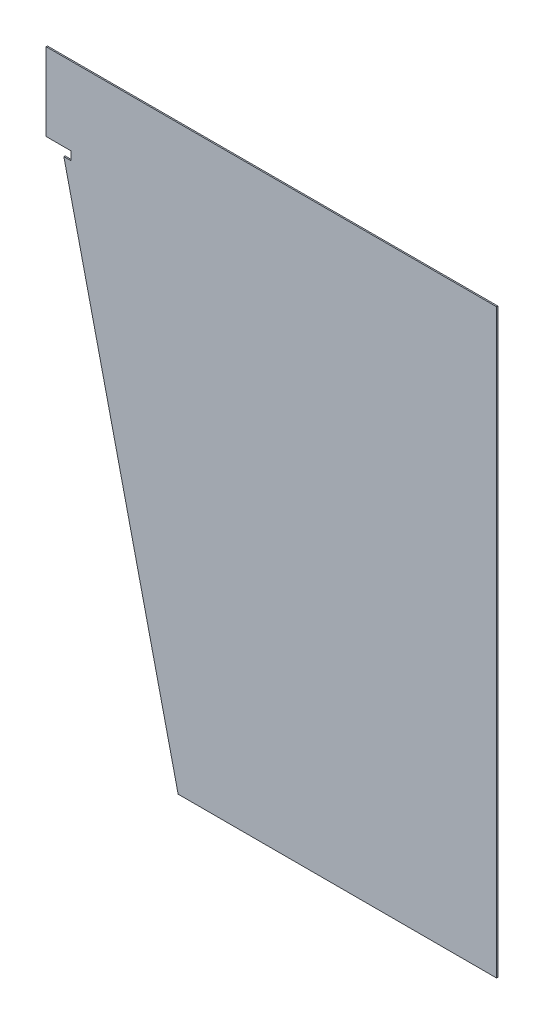
ISO-10303-21;
HEADER;
FILE_DESCRIPTION(('STEP AP214'),'2;1');
FILE_NAME('part.step','',(''),(''),'','','');
FILE_SCHEMA(('AUTOMOTIVE_DESIGN { 1 0 10303 214 1 1 1 1 }'));
ENDSEC;
DATA;
#1=APPLICATION_CONTEXT('core data for automotive mechanical design processes');
#2=APPLICATION_PROTOCOL_DEFINITION('international standard','automotive_design',2000,#1);
#3=PRODUCT_CONTEXT('',#1,'mechanical');
#4=PRODUCT('Part','Part','',(#3));
#5=PRODUCT_RELATED_PRODUCT_CATEGORY('part','',(#4));
#6=PRODUCT_DEFINITION_FORMATION('','',#4);
#7=PRODUCT_DEFINITION_CONTEXT('part definition',#1,'design');
#8=PRODUCT_DEFINITION('design','',#6,#7);
#9=PRODUCT_DEFINITION_SHAPE('','',#8);
#10=(LENGTH_UNIT() NAMED_UNIT(*) SI_UNIT(.MILLI.,.METRE.));
#11=(NAMED_UNIT(*) PLANE_ANGLE_UNIT() SI_UNIT($,.RADIAN.));
#12=(NAMED_UNIT(*) SI_UNIT($,.STERADIAN.) SOLID_ANGLE_UNIT());
#13=UNCERTAINTY_MEASURE_WITH_UNIT(LENGTH_MEASURE(1.E-05),#10,'distance_accuracy_value','');
#14=(GEOMETRIC_REPRESENTATION_CONTEXT(3) GLOBAL_UNCERTAINTY_ASSIGNED_CONTEXT((#13)) GLOBAL_UNIT_ASSIGNED_CONTEXT((#10,
#11,#12)) REPRESENTATION_CONTEXT('',''));
#15=CARTESIAN_POINT('',(0.,0.,0.));
#16=DIRECTION('',(0.,0.,1.));
#17=DIRECTION('',(1.,0.,0.));
#18=AXIS2_PLACEMENT_3D('',#15,#16,#17);
#19=CARTESIAN_POINT('',(670.,0.,1.9));
#20=DIRECTION('',(0.,-1.,0.));
#21=DIRECTION('',(1.,0.,0.));
#22=AXIS2_PLACEMENT_3D('',#19,#20,#21);
#23=PLANE('',#22);
#24=DIRECTION('',(-1.,0.,0.));
#25=VECTOR('',#24,1.);
#26=CARTESIAN_POINT('',(670.,0.,0.));
#27=LINE('',#26,#25);
#28=CARTESIAN_POINT('',(670.,0.,0.));
#29=VERTEX_POINT('',#28);
#30=CARTESIAN_POINT('',(0.,0.,0.));
#31=VERTEX_POINT('',#30);
#32=EDGE_CURVE('E132',#29,#31,#27,.T.);
#33=ORIENTED_EDGE('',*,*,#32,.T.);
#34=DIRECTION('',(0.,0.,-1.));
#35=VECTOR('',#34,1.);
#36=CARTESIAN_POINT('',(0.,0.,1.9));
#37=LINE('',#36,#35);
#38=CARTESIAN_POINT('',(0.,0.,1.9));
#39=VERTEX_POINT('',#38);
#40=EDGE_CURVE('E11',#39,#31,#37,.T.);
#41=ORIENTED_EDGE('',*,*,#40,.F.);
#42=DIRECTION('',(-1.,0.,0.));
#43=VECTOR('',#42,1.);
#44=CARTESIAN_POINT('',(670.,0.,1.9));
#45=LINE('',#44,#43);
#46=CARTESIAN_POINT('',(670.,0.,1.9));
#47=VERTEX_POINT('',#46);
#48=EDGE_CURVE('E146',#47,#39,#45,.T.);
#49=ORIENTED_EDGE('',*,*,#48,.F.);
#50=DIRECTION('',(0.,0.,-1.));
#51=VECTOR('',#50,1.);
#52=CARTESIAN_POINT('',(670.,0.,1.9));
#53=LINE('',#52,#51);
#54=EDGE_CURVE('E128',#47,#29,#53,.T.);
#55=ORIENTED_EDGE('',*,*,#54,.T.);
#56=EDGE_LOOP('',(#33,#41,#49,#55));
#57=FACE_BOUND('',#56,.T.);
#58=ADVANCED_FACE('F36',(#57),#23,.F.);
#59=CARTESIAN_POINT('',(0.,0.,1.9));
#60=DIRECTION('',(1.,0.,0.));
#61=DIRECTION('',(0.,0.,-1.));
#62=AXIS2_PLACEMENT_3D('',#59,#60,#61);
#63=PLANE('',#62);
#64=DIRECTION('',(0.,-1.,0.));
#65=VECTOR('',#64,1.);
#66=CARTESIAN_POINT('',(0.,0.,0.));
#67=LINE('',#66,#65);
#68=CARTESIAN_POINT('',(0.,-115.76,0.));
#69=VERTEX_POINT('',#68);
#70=EDGE_CURVE('E135',#31,#69,#67,.T.);
#71=ORIENTED_EDGE('',*,*,#70,.T.);
#72=DIRECTION('',(0.,0.,-1.));
#73=VECTOR('',#72,1.);
#74=CARTESIAN_POINT('',(0.,-115.76,1.9));
#75=LINE('',#74,#73);
#76=CARTESIAN_POINT('',(0.,-115.76,1.9));
#77=VERTEX_POINT('',#76);
#78=EDGE_CURVE('E44',#77,#69,#75,.T.);
#79=ORIENTED_EDGE('',*,*,#78,.F.);
#80=DIRECTION('',(0.,-1.,0.));
#81=VECTOR('',#80,1.);
#82=CARTESIAN_POINT('',(0.,0.,1.9));
#83=LINE('',#82,#81);
#84=EDGE_CURVE('E95',#39,#77,#83,.T.);
#85=ORIENTED_EDGE('',*,*,#84,.F.);
#86=ORIENTED_EDGE('',*,*,#40,.T.);
#87=EDGE_LOOP('',(#71,#79,#85,#86));
#88=FACE_BOUND('',#87,.T.);
#89=ADVANCED_FACE('F181',(#88),#63,.F.);
#90=CARTESIAN_POINT('',(0.,-115.76,1.9));
#91=DIRECTION('',(0.,1.,0.));
#92=DIRECTION('',(0.,0.,1.));
#93=AXIS2_PLACEMENT_3D('',#90,#91,#92);
#94=PLANE('',#93);
#95=DIRECTION('',(1.,0.,0.));
#96=VECTOR('',#95,1.);
#97=CARTESIAN_POINT('',(0.,-115.76,0.));
#98=LINE('',#97,#96);
#99=CARTESIAN_POINT('',(37.,-115.76,0.));
#100=VERTEX_POINT('',#99);
#101=EDGE_CURVE('E137',#69,#100,#98,.T.);
#102=ORIENTED_EDGE('',*,*,#101,.T.);
#103=DIRECTION('',(0.,0.,-1.));
#104=VECTOR('',#103,1.);
#105=CARTESIAN_POINT('',(37.,-115.76,1.9));
#106=LINE('',#105,#104);
#107=CARTESIAN_POINT('',(37.,-115.76,1.9));
#108=VERTEX_POINT('',#107);
#109=EDGE_CURVE('E153',#108,#100,#106,.T.);
#110=ORIENTED_EDGE('',*,*,#109,.F.);
#111=DIRECTION('',(1.,0.,0.));
#112=VECTOR('',#111,1.);
#113=CARTESIAN_POINT('',(0.,-115.76,1.9));
#114=LINE('',#113,#112);
#115=EDGE_CURVE('E161',#77,#108,#114,.T.);
#116=ORIENTED_EDGE('',*,*,#115,.F.);
#117=ORIENTED_EDGE('',*,*,#78,.T.);
#118=EDGE_LOOP('',(#102,#110,#116,#117));
#119=FACE_BOUND('',#118,.T.);
#120=ADVANCED_FACE('F159',(#119),#94,.F.);
#121=CARTESIAN_POINT('',(37.,-115.76,1.9));
#122=DIRECTION('',(1.,0.,0.));
#123=DIRECTION('',(0.,1.,0.));
#124=AXIS2_PLACEMENT_3D('',#121,#122,#123);
#125=PLANE('',#124);
#126=DIRECTION('',(0.,-1.,0.));
#127=VECTOR('',#126,1.);
#128=CARTESIAN_POINT('',(37.,-115.76,0.));
#129=LINE('',#128,#127);
#130=CARTESIAN_POINT('',(37.,-128.46,0.));
#131=VERTEX_POINT('',#130);
#132=EDGE_CURVE('E139',#100,#131,#129,.T.);
#133=ORIENTED_EDGE('',*,*,#132,.T.);
#134=DIRECTION('',(0.,0.,-1.));
#135=VECTOR('',#134,1.);
#136=CARTESIAN_POINT('',(37.,-128.46,1.9));
#137=LINE('',#136,#135);
#138=CARTESIAN_POINT('',(37.,-128.46,1.9));
#139=VERTEX_POINT('',#138);
#140=EDGE_CURVE('E150',#139,#131,#137,.T.);
#141=ORIENTED_EDGE('',*,*,#140,.F.);
#142=DIRECTION('',(0.,-1.,0.));
#143=VECTOR('',#142,1.);
#144=CARTESIAN_POINT('',(37.,-115.76,1.9));
#145=LINE('',#144,#143);
#146=EDGE_CURVE('E173',#108,#139,#145,.T.);
#147=ORIENTED_EDGE('',*,*,#146,.F.);
#148=ORIENTED_EDGE('',*,*,#109,.T.);
#149=EDGE_LOOP('',(#133,#141,#147,#148));
#150=FACE_BOUND('',#149,.T.);
#151=ADVANCED_FACE('F169',(#150),#125,.F.);
#152=CARTESIAN_POINT('',(37.,-128.46,1.9));
#153=DIRECTION('',(0.,-1.,0.));
#154=DIRECTION('',(1.,0.,0.));
#155=AXIS2_PLACEMENT_3D('',#152,#153,#154);
#156=PLANE('',#155);
#157=DIRECTION('',(-1.,0.,0.));
#158=VECTOR('',#157,1.);
#159=CARTESIAN_POINT('',(37.,-128.46,0.));
#160=LINE('',#159,#158);
#161=CARTESIAN_POINT('',(26.24,-128.46,0.));
#162=VERTEX_POINT('',#161);
#163=EDGE_CURVE('E141',#131,#162,#160,.T.);
#164=ORIENTED_EDGE('',*,*,#163,.T.);
#165=DIRECTION('',(0.,0.,-1.));
#166=VECTOR('',#165,1.);
#167=CARTESIAN_POINT('',(26.24,-128.46,1.9));
#168=LINE('',#167,#166);
#169=CARTESIAN_POINT('',(26.24,-128.46,1.9));
#170=VERTEX_POINT('',#169);
#171=EDGE_CURVE('E123',#170,#162,#168,.T.);
#172=ORIENTED_EDGE('',*,*,#171,.F.);
#173=DIRECTION('',(-1.,0.,0.));
#174=VECTOR('',#173,1.);
#175=CARTESIAN_POINT('',(37.,-128.46,1.9));
#176=LINE('',#175,#174);
#177=EDGE_CURVE('E114',#139,#170,#176,.T.);
#178=ORIENTED_EDGE('',*,*,#177,.F.);
#179=ORIENTED_EDGE('',*,*,#140,.T.);
#180=EDGE_LOOP('',(#164,#172,#178,#179));
#181=FACE_BOUND('',#180,.T.);
#182=ADVANCED_FACE('F172',(#181),#156,.F.);
#183=CARTESIAN_POINT('',(26.24,-128.46,1.9));
#184=DIRECTION('',(0.974370064785234,0.224951054343869,0.));
#185=DIRECTION('',(-0.224951054343869,0.974370064785234,0.));
#186=AXIS2_PLACEMENT_3D('',#183,#184,#185);
#187=PLANE('',#186);
#188=DIRECTION('',(0.224951054343869,-0.974370064785234,0.));
#189=VECTOR('',#188,1.);
#190=CARTESIAN_POINT('',(26.24,-128.46,0.));
#191=LINE('',#190,#189);
#192=CARTESIAN_POINT('',(196.283657491625,-865.,0.));
#193=VERTEX_POINT('',#192);
#194=EDGE_CURVE('E122',#162,#193,#191,.T.);
#195=ORIENTED_EDGE('',*,*,#194,.T.);
#196=DIRECTION('',(0.,0.,-1.));
#197=VECTOR('',#196,1.);
#198=CARTESIAN_POINT('',(196.283657491625,-865.,1.9));
#199=LINE('',#198,#197);
#200=CARTESIAN_POINT('',(196.283657491625,-865.,1.9));
#201=VERTEX_POINT('',#200);
#202=EDGE_CURVE('E119',#201,#193,#199,.T.);
#203=ORIENTED_EDGE('',*,*,#202,.F.);
#204=DIRECTION('',(0.224951054343869,-0.974370064785234,0.));
#205=VECTOR('',#204,1.);
#206=CARTESIAN_POINT('',(26.24,-128.46,1.9));
#207=LINE('',#206,#205);
#208=EDGE_CURVE('E108',#170,#201,#207,.T.);
#209=ORIENTED_EDGE('',*,*,#208,.F.);
#210=ORIENTED_EDGE('',*,*,#171,.T.);
#211=EDGE_LOOP('',(#195,#203,#209,#210));
#212=FACE_BOUND('',#211,.T.);
#213=ADVANCED_FACE('F120',(#212),#187,.F.);
#214=CARTESIAN_POINT('',(196.283657491625,-865.,1.9));
#215=DIRECTION('',(0.,1.,0.));
#216=DIRECTION('',(0.,0.,1.));
#217=AXIS2_PLACEMENT_3D('',#214,#215,#216);
#218=PLANE('',#217);
#219=DIRECTION('',(1.,0.,0.));
#220=VECTOR('',#219,1.);
#221=CARTESIAN_POINT('',(196.283657491625,-865.,0.));
#222=LINE('',#221,#220);
#223=CARTESIAN_POINT('',(670.,-865.,0.));
#224=VERTEX_POINT('',#223);
#225=EDGE_CURVE('E81',#193,#224,#222,.T.);
#226=ORIENTED_EDGE('',*,*,#225,.T.);
#227=DIRECTION('',(0.,0.,-1.));
#228=VECTOR('',#227,1.);
#229=CARTESIAN_POINT('',(670.,-865.,1.9));
#230=LINE('',#229,#228);
#231=CARTESIAN_POINT('',(670.,-865.,1.9));
#232=VERTEX_POINT('',#231);
#233=EDGE_CURVE('E124',#232,#224,#230,.T.);
#234=ORIENTED_EDGE('',*,*,#233,.F.);
#235=DIRECTION('',(1.,0.,0.));
#236=VECTOR('',#235,1.);
#237=CARTESIAN_POINT('',(196.283657491625,-865.,1.9));
#238=LINE('',#237,#236);
#239=EDGE_CURVE('E112',#201,#232,#238,.T.);
#240=ORIENTED_EDGE('',*,*,#239,.F.);
#241=ORIENTED_EDGE('',*,*,#202,.T.);
#242=EDGE_LOOP('',(#226,#234,#240,#241));
#243=FACE_BOUND('',#242,.T.);
#244=ADVANCED_FACE('F126',(#243),#218,.F.);
#245=CARTESIAN_POINT('',(670.,-865.,1.9));
#246=DIRECTION('',(-1.,0.,0.));
#247=DIRECTION('',(0.,0.,1.));
#248=AXIS2_PLACEMENT_3D('',#245,#246,#247);
#249=PLANE('',#248);
#250=DIRECTION('',(0.,1.,0.));
#251=VECTOR('',#250,1.);
#252=CARTESIAN_POINT('',(670.,-865.,0.));
#253=LINE('',#252,#251);
#254=EDGE_CURVE('E87',#224,#29,#253,.T.);
#255=ORIENTED_EDGE('',*,*,#254,.T.);
#256=ORIENTED_EDGE('',*,*,#54,.F.);
#257=DIRECTION('',(0.,1.,0.));
#258=VECTOR('',#257,1.);
#259=CARTESIAN_POINT('',(670.,-865.,1.9));
#260=LINE('',#259,#258);
#261=EDGE_CURVE('E52',#232,#47,#260,.T.);
#262=ORIENTED_EDGE('',*,*,#261,.F.);
#263=ORIENTED_EDGE('',*,*,#233,.T.);
#264=EDGE_LOOP('',(#255,#256,#262,#263));
#265=FACE_BOUND('',#264,.T.);
#266=ADVANCED_FACE('F197',(#265),#249,.F.);
#267=CARTESIAN_POINT('',(0.,0.,1.9));
#268=DIRECTION('',(0.,0.,1.));
#269=DIRECTION('',(1.,0.,0.));
#270=AXIS2_PLACEMENT_3D('',#267,#268,#269);
#271=PLANE('',#270);
#272=ORIENTED_EDGE('',*,*,#48,.T.);
#273=ORIENTED_EDGE('',*,*,#84,.T.);
#274=ORIENTED_EDGE('',*,*,#115,.T.);
#275=ORIENTED_EDGE('',*,*,#146,.T.);
#276=ORIENTED_EDGE('',*,*,#177,.T.);
#277=ORIENTED_EDGE('',*,*,#208,.T.);
#278=ORIENTED_EDGE('',*,*,#239,.T.);
#279=ORIENTED_EDGE('',*,*,#261,.T.);
#280=EDGE_LOOP('',(#272,#273,#274,#275,#276,#277,#278,#279));
#281=FACE_BOUND('',#280,.T.);
#282=ADVANCED_FACE('F110',(#281),#271,.T.);
#283=CARTESIAN_POINT('',(0.,0.,0.));
#284=DIRECTION('',(0.,0.,1.));
#285=DIRECTION('',(1.,0.,0.));
#286=AXIS2_PLACEMENT_3D('',#283,#284,#285);
#287=PLANE('',#286);
#288=ORIENTED_EDGE('',*,*,#32,.F.);
#289=ORIENTED_EDGE('',*,*,#254,.F.);
#290=ORIENTED_EDGE('',*,*,#225,.F.);
#291=ORIENTED_EDGE('',*,*,#194,.F.);
#292=ORIENTED_EDGE('',*,*,#163,.F.);
#293=ORIENTED_EDGE('',*,*,#132,.F.);
#294=ORIENTED_EDGE('',*,*,#101,.F.);
#295=ORIENTED_EDGE('',*,*,#70,.F.);
#296=EDGE_LOOP('',(#288,#289,#290,#291,#292,#293,#294,#295));
#297=FACE_BOUND('',#296,.T.);
#298=ADVANCED_FACE('F165',(#297),#287,.F.);
#299=CLOSED_SHELL('',(#58,#89,#120,#151,#182,#213,#244,#266,#282,#298));
#300=MANIFOLD_SOLID_BREP('B2',#299);
#301=ADVANCED_BREP_SHAPE_REPRESENTATION('',(#18,#300),#14);
#302=SHAPE_DEFINITION_REPRESENTATION(#9,#301);
ENDSEC;
END-ISO-10303-21;
